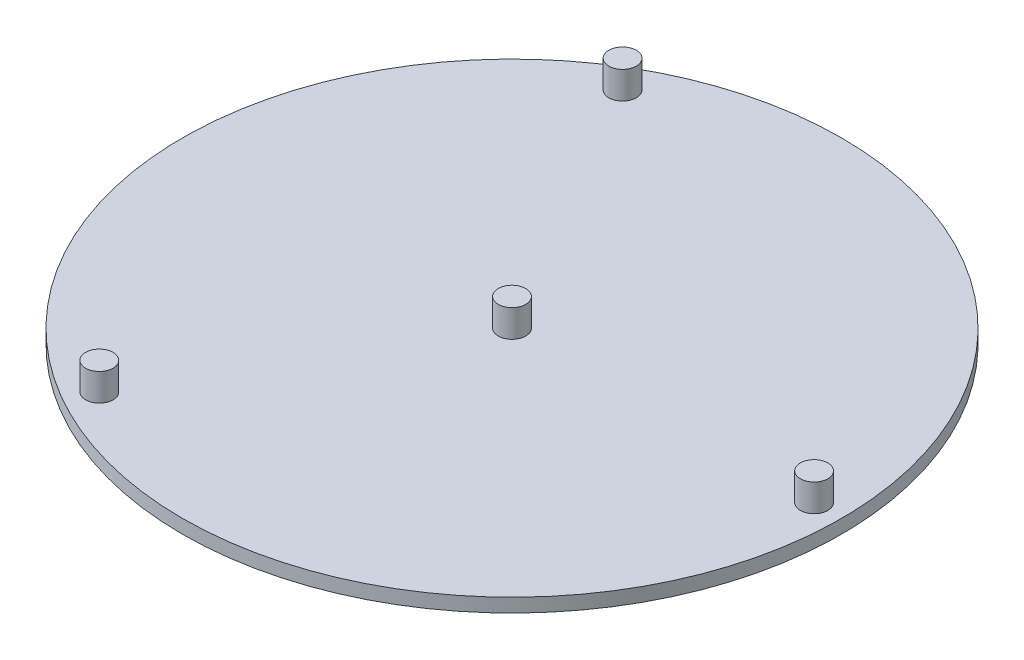
ISO-10303-21;
HEADER;
FILE_DESCRIPTION(('STEP AP214'),'2;1');
FILE_NAME('part.step','',(''),(''),'','','');
FILE_SCHEMA(('AUTOMOTIVE_DESIGN { 1 0 10303 214 1 1 1 1 }'));
ENDSEC;
DATA;
#1=APPLICATION_CONTEXT('core data for automotive mechanical design processes');
#2=APPLICATION_PROTOCOL_DEFINITION('international standard','automotive_design',2000,#1);
#3=PRODUCT_CONTEXT('',#1,'mechanical');
#4=PRODUCT('Part','Part','',(#3));
#5=PRODUCT_RELATED_PRODUCT_CATEGORY('part','',(#4));
#6=PRODUCT_DEFINITION_FORMATION('','',#4);
#7=PRODUCT_DEFINITION_CONTEXT('part definition',#1,'design');
#8=PRODUCT_DEFINITION('design','',#6,#7);
#9=PRODUCT_DEFINITION_SHAPE('','',#8);
#10=(LENGTH_UNIT() NAMED_UNIT(*) SI_UNIT(.MILLI.,.METRE.));
#11=(NAMED_UNIT(*) PLANE_ANGLE_UNIT() SI_UNIT($,.RADIAN.));
#12=(NAMED_UNIT(*) SI_UNIT($,.STERADIAN.) SOLID_ANGLE_UNIT());
#13=UNCERTAINTY_MEASURE_WITH_UNIT(LENGTH_MEASURE(1.E-05),#10,'distance_accuracy_value','');
#14=(GEOMETRIC_REPRESENTATION_CONTEXT(3) GLOBAL_UNCERTAINTY_ASSIGNED_CONTEXT((#13)) GLOBAL_UNIT_ASSIGNED_CONTEXT((#10,
#11,#12)) REPRESENTATION_CONTEXT('',''));
#15=CARTESIAN_POINT('',(0.,0.,0.));
#16=DIRECTION('',(0.,0.,1.));
#17=DIRECTION('',(1.,0.,0.));
#18=AXIS2_PLACEMENT_3D('',#15,#16,#17);
#19=CARTESIAN_POINT('',(0.,3.175,0.));
#20=DIRECTION('',(0.,-1.,0.));
#21=DIRECTION('',(0.,0.,-1.));
#22=AXIS2_PLACEMENT_3D('',#19,#20,#21);
#23=CYLINDRICAL_SURFACE('',#22,76.2);
#24=CARTESIAN_POINT('',(0.,3.175,0.));
#25=DIRECTION('',(0.,1.,0.));
#26=DIRECTION('',(0.,0.,1.));
#27=AXIS2_PLACEMENT_3D('',#24,#25,#26);
#28=CIRCLE('',#27,76.2);
#29=CARTESIAN_POINT('',(0.,3.175,76.2));
#30=VERTEX_POINT('',#29);
#31=EDGE_CURVE('E10',#30,#30,#28,.T.);
#32=ORIENTED_EDGE('',*,*,#31,.F.);
#33=EDGE_LOOP('',(#32));
#34=FACE_BOUND('',#33,.T.);
#35=CARTESIAN_POINT('',(0.,0.,0.));
#36=DIRECTION('',(0.,1.,0.));
#37=DIRECTION('',(0.,0.,1.));
#38=AXIS2_PLACEMENT_3D('',#35,#36,#37);
#39=CIRCLE('',#38,76.2);
#40=CARTESIAN_POINT('',(0.,0.,76.2));
#41=VERTEX_POINT('',#40);
#42=EDGE_CURVE('E34',#41,#41,#39,.T.);
#43=ORIENTED_EDGE('',*,*,#42,.T.);
#44=EDGE_LOOP('',(#43));
#45=FACE_BOUND('',#44,.T.);
#46=ADVANCED_FACE('F31',(#34,#45),#23,.T.);
#47=CARTESIAN_POINT('',(0.,3.175,0.));
#48=DIRECTION('',(0.,1.,0.));
#49=DIRECTION('',(0.,0.,1.));
#50=AXIS2_PLACEMENT_3D('',#47,#48,#49);
#51=PLANE('',#50);
#52=CARTESIAN_POINT('',(-34.9249999999994,3.175,60.4918744543434));
#53=DIRECTION('',(0.,1.,0.));
#54=DIRECTION('',(-0.866025403784443,0.,-0.499999999999992));
#55=AXIS2_PLACEMENT_3D('',#52,#53,#54);
#56=CIRCLE('',#55,3.175);
#57=CARTESIAN_POINT('',(-37.674630657015,3.175,58.9043744543434));
#58=VERTEX_POINT('',#57);
#59=EDGE_CURVE('E61',#58,#58,#56,.T.);
#60=ORIENTED_EDGE('',*,*,#59,.F.);
#61=EDGE_LOOP('',(#60));
#62=FACE_BOUND('',#61,.T.);
#63=CARTESIAN_POINT('',(-34.9250000000003,3.175,-60.4918744543429));
#64=DIRECTION('',(0.,1.,0.));
#65=DIRECTION('',(0.866025403784436,0.,-0.500000000000004));
#66=AXIS2_PLACEMENT_3D('',#63,#64,#65);
#67=CIRCLE('',#66,3.175);
#68=CARTESIAN_POINT('',(-32.1753693429847,3.175,-62.0793744543429));
#69=VERTEX_POINT('',#68);
#70=EDGE_CURVE('E55',#69,#69,#67,.T.);
#71=ORIENTED_EDGE('',*,*,#70,.F.);
#72=EDGE_LOOP('',(#71));
#73=FACE_BOUND('',#72,.T.);
#74=CARTESIAN_POINT('',(69.85,3.175,0.));
#75=DIRECTION('',(0.,1.,0.));
#76=DIRECTION('',(0.,0.,1.));
#77=AXIS2_PLACEMENT_3D('',#74,#75,#76);
#78=CIRCLE('',#77,3.175);
#79=CARTESIAN_POINT('',(69.85,3.175,3.175));
#80=VERTEX_POINT('',#79);
#81=EDGE_CURVE('E49',#80,#80,#78,.T.);
#82=ORIENTED_EDGE('',*,*,#81,.F.);
#83=EDGE_LOOP('',(#82));
#84=FACE_BOUND('',#83,.T.);
#85=CARTESIAN_POINT('',(0.,3.175,0.));
#86=DIRECTION('',(0.,1.,0.));
#87=DIRECTION('',(0.,0.,1.));
#88=AXIS2_PLACEMENT_3D('',#85,#86,#87);
#89=CIRCLE('',#88,3.175);
#90=CARTESIAN_POINT('',(0.,3.175,3.175));
#91=VERTEX_POINT('',#90);
#92=EDGE_CURVE('E43',#91,#91,#89,.T.);
#93=ORIENTED_EDGE('',*,*,#92,.F.);
#94=EDGE_LOOP('',(#93));
#95=FACE_BOUND('',#94,.T.);
#96=ORIENTED_EDGE('',*,*,#31,.T.);
#97=EDGE_LOOP('',(#96));
#98=FACE_BOUND('',#97,.T.);
#99=ADVANCED_FACE('F76',(#62,#73,#84,#95,#98),#51,.T.);
#100=CARTESIAN_POINT('',(0.,0.,0.));
#101=DIRECTION('',(0.,1.,0.));
#102=DIRECTION('',(0.,0.,1.));
#103=AXIS2_PLACEMENT_3D('',#100,#101,#102);
#104=PLANE('',#103);
#105=ORIENTED_EDGE('',*,*,#42,.F.);
#106=EDGE_LOOP('',(#105));
#107=FACE_BOUND('',#106,.T.);
#108=ADVANCED_FACE('F79',(#107),#104,.F.);
#109=CARTESIAN_POINT('',(0.,9.525,0.));
#110=DIRECTION('',(0.,-1.,0.));
#111=DIRECTION('',(0.,0.,-1.));
#112=AXIS2_PLACEMENT_3D('',#109,#110,#111);
#113=CYLINDRICAL_SURFACE('',#112,3.175);
#114=CARTESIAN_POINT('',(0.,9.525,0.));
#115=DIRECTION('',(0.,1.,0.));
#116=DIRECTION('',(0.,0.,1.));
#117=AXIS2_PLACEMENT_3D('',#114,#115,#116);
#118=CIRCLE('',#117,3.175);
#119=CARTESIAN_POINT('',(0.,9.525,3.175));
#120=VERTEX_POINT('',#119);
#121=EDGE_CURVE('E41',#120,#120,#118,.T.);
#122=ORIENTED_EDGE('',*,*,#121,.F.);
#123=EDGE_LOOP('',(#122));
#124=FACE_BOUND('',#123,.T.);
#125=ORIENTED_EDGE('',*,*,#92,.T.);
#126=EDGE_LOOP('',(#125));
#127=FACE_BOUND('',#126,.T.);
#128=ADVANCED_FACE('F87',(#124,#127),#113,.T.);
#129=CARTESIAN_POINT('',(0.,9.525,0.));
#130=DIRECTION('',(0.,1.,0.));
#131=DIRECTION('',(0.,0.,1.));
#132=AXIS2_PLACEMENT_3D('',#129,#130,#131);
#133=PLANE('',#132);
#134=ORIENTED_EDGE('',*,*,#121,.T.);
#135=EDGE_LOOP('',(#134));
#136=FACE_BOUND('',#135,.T.);
#137=ADVANCED_FACE('F89',(#136),#133,.T.);
#138=CARTESIAN_POINT('',(69.85,9.525,0.));
#139=DIRECTION('',(0.,-1.,0.));
#140=DIRECTION('',(0.,0.,-1.));
#141=AXIS2_PLACEMENT_3D('',#138,#139,#140);
#142=CYLINDRICAL_SURFACE('',#141,3.175);
#143=CARTESIAN_POINT('',(69.85,9.525,0.));
#144=DIRECTION('',(0.,1.,0.));
#145=DIRECTION('',(0.,0.,1.));
#146=AXIS2_PLACEMENT_3D('',#143,#144,#145);
#147=CIRCLE('',#146,3.175);
#148=CARTESIAN_POINT('',(69.85,9.525,3.175));
#149=VERTEX_POINT('',#148);
#150=EDGE_CURVE('E46',#149,#149,#147,.T.);
#151=ORIENTED_EDGE('',*,*,#150,.F.);
#152=EDGE_LOOP('',(#151));
#153=FACE_BOUND('',#152,.T.);
#154=ORIENTED_EDGE('',*,*,#81,.T.);
#155=EDGE_LOOP('',(#154));
#156=FACE_BOUND('',#155,.T.);
#157=ADVANCED_FACE('F96',(#153,#156),#142,.T.);
#158=CARTESIAN_POINT('',(69.85,9.525,0.));
#159=DIRECTION('',(0.,1.,0.));
#160=DIRECTION('',(0.,0.,1.));
#161=AXIS2_PLACEMENT_3D('',#158,#159,#160);
#162=PLANE('',#161);
#163=ORIENTED_EDGE('',*,*,#150,.T.);
#164=EDGE_LOOP('',(#163));
#165=FACE_BOUND('',#164,.T.);
#166=ADVANCED_FACE('F135',(#165),#162,.T.);
#167=CARTESIAN_POINT('',(-34.9250000000003,9.525,-60.4918744543429));
#168=DIRECTION('',(0.,-1.,0.));
#169=DIRECTION('',(0.,0.,-1.));
#170=AXIS2_PLACEMENT_3D('',#167,#168,#169);
#171=CYLINDRICAL_SURFACE('',#170,3.175);
#172=CARTESIAN_POINT('',(-34.9250000000003,9.525,-60.4918744543429));
#173=DIRECTION('',(0.,1.,0.));
#174=DIRECTION('',(0.866025403784436,0.,-0.500000000000004));
#175=AXIS2_PLACEMENT_3D('',#172,#173,#174);
#176=CIRCLE('',#175,3.175);
#177=CARTESIAN_POINT('',(-32.1753693429847,9.525,-62.0793744543429));
#178=VERTEX_POINT('',#177);
#179=EDGE_CURVE('E52',#178,#178,#176,.T.);
#180=ORIENTED_EDGE('',*,*,#179,.F.);
#181=EDGE_LOOP('',(#180));
#182=FACE_BOUND('',#181,.T.);
#183=ORIENTED_EDGE('',*,*,#70,.T.);
#184=EDGE_LOOP('',(#183));
#185=FACE_BOUND('',#184,.T.);
#186=ADVANCED_FACE('F144',(#182,#185),#171,.T.);
#187=CARTESIAN_POINT('',(-34.9250000000003,9.525,-60.4918744543429));
#188=DIRECTION('',(0.,1.,0.));
#189=DIRECTION('',(0.866025403784436,0.,-0.500000000000004));
#190=AXIS2_PLACEMENT_3D('',#187,#188,#189);
#191=PLANE('',#190);
#192=ORIENTED_EDGE('',*,*,#179,.T.);
#193=EDGE_LOOP('',(#192));
#194=FACE_BOUND('',#193,.T.);
#195=ADVANCED_FACE('F72',(#194),#191,.T.);
#196=CARTESIAN_POINT('',(-34.9249999999994,9.525,60.4918744543434));
#197=DIRECTION('',(0.,-1.,0.));
#198=DIRECTION('',(0.,0.,-1.));
#199=AXIS2_PLACEMENT_3D('',#196,#197,#198);
#200=CYLINDRICAL_SURFACE('',#199,3.175);
#201=CARTESIAN_POINT('',(-34.9249999999994,9.525,60.4918744543434));
#202=DIRECTION('',(0.,1.,0.));
#203=DIRECTION('',(-0.866025403784443,0.,-0.499999999999992));
#204=AXIS2_PLACEMENT_3D('',#201,#202,#203);
#205=CIRCLE('',#204,3.175);
#206=CARTESIAN_POINT('',(-37.674630657015,9.525,58.9043744543434));
#207=VERTEX_POINT('',#206);
#208=EDGE_CURVE('E58',#207,#207,#205,.T.);
#209=ORIENTED_EDGE('',*,*,#208,.F.);
#210=EDGE_LOOP('',(#209));
#211=FACE_BOUND('',#210,.T.);
#212=ORIENTED_EDGE('',*,*,#59,.T.);
#213=EDGE_LOOP('',(#212));
#214=FACE_BOUND('',#213,.T.);
#215=ADVANCED_FACE('F69',(#211,#214),#200,.T.);
#216=CARTESIAN_POINT('',(-34.9249999999994,9.525,60.4918744543434));
#217=DIRECTION('',(0.,1.,0.));
#218=DIRECTION('',(-0.866025403784443,0.,-0.499999999999992));
#219=AXIS2_PLACEMENT_3D('',#216,#217,#218);
#220=PLANE('',#219);
#221=ORIENTED_EDGE('',*,*,#208,.T.);
#222=EDGE_LOOP('',(#221));
#223=FACE_BOUND('',#222,.T.);
#224=ADVANCED_FACE('F67',(#223),#220,.T.);
#225=CLOSED_SHELL('',(#46,#99,#108,#128,#137,#157,#166,#186,#195,#215,#224));
#226=MANIFOLD_SOLID_BREP('B2',#225);
#227=ADVANCED_BREP_SHAPE_REPRESENTATION('',(#18,#226),#14);
#228=SHAPE_DEFINITION_REPRESENTATION(#9,#227);
ENDSEC;
END-ISO-10303-21;
